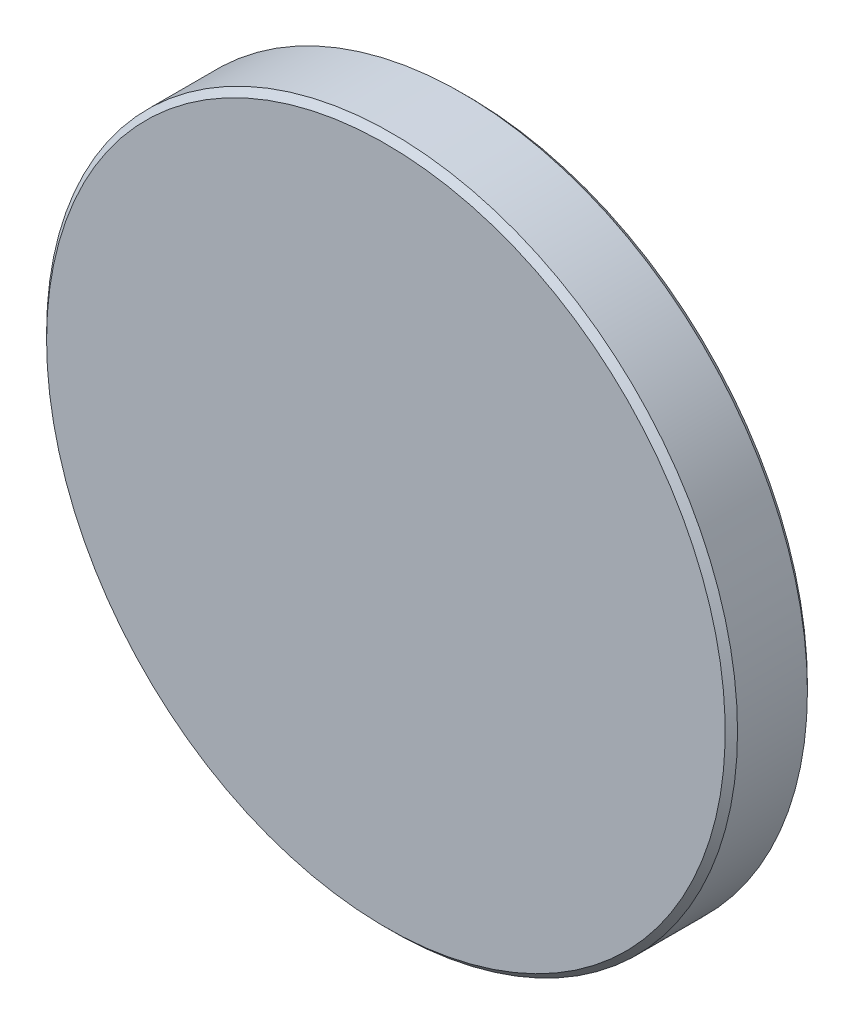
ISO-10303-21;
HEADER;
FILE_DESCRIPTION(('STEP AP214'),'2;1');
FILE_NAME('part.step','',(''),(''),'','','');
FILE_SCHEMA(('AUTOMOTIVE_DESIGN { 1 0 10303 214 1 1 1 1 }'));
ENDSEC;
DATA;
#1=APPLICATION_CONTEXT('core data for automotive mechanical design processes');
#2=APPLICATION_PROTOCOL_DEFINITION('international standard','automotive_design',2000,#1);
#3=PRODUCT_CONTEXT('',#1,'mechanical');
#4=PRODUCT('Part','Part','',(#3));
#5=PRODUCT_RELATED_PRODUCT_CATEGORY('part','',(#4));
#6=PRODUCT_DEFINITION_FORMATION('','',#4);
#7=PRODUCT_DEFINITION_CONTEXT('part definition',#1,'design');
#8=PRODUCT_DEFINITION('design','',#6,#7);
#9=PRODUCT_DEFINITION_SHAPE('','',#8);
#10=(LENGTH_UNIT() NAMED_UNIT(*) SI_UNIT(.MILLI.,.METRE.));
#11=(NAMED_UNIT(*) PLANE_ANGLE_UNIT() SI_UNIT($,.RADIAN.));
#12=(NAMED_UNIT(*) SI_UNIT($,.STERADIAN.) SOLID_ANGLE_UNIT());
#13=UNCERTAINTY_MEASURE_WITH_UNIT(LENGTH_MEASURE(1.E-05),#10,'distance_accuracy_value','');
#14=(GEOMETRIC_REPRESENTATION_CONTEXT(3) GLOBAL_UNCERTAINTY_ASSIGNED_CONTEXT((#13)) GLOBAL_UNIT_ASSIGNED_CONTEXT((#10,
#11,#12)) REPRESENTATION_CONTEXT('',''));
#15=CARTESIAN_POINT('',(0.,0.,0.));
#16=DIRECTION('',(0.,0.,1.));
#17=DIRECTION('',(1.,0.,0.));
#18=AXIS2_PLACEMENT_3D('',#15,#16,#17);
#19=CARTESIAN_POINT('',(0.,0.,4.));
#20=DIRECTION('',(0.,0.,1.));
#21=DIRECTION('',(1.,0.,0.));
#22=AXIS2_PLACEMENT_3D('',#19,#20,#21);
#23=PLANE('',#22);
#24=CARTESIAN_POINT('',(0.,0.,4.));
#25=DIRECTION('',(0.,0.,-1.));
#26=DIRECTION('',(-1.,0.,0.));
#27=AXIS2_PLACEMENT_3D('',#24,#25,#26);
#28=CIRCLE('',#27,16.5072964032);
#29=CARTESIAN_POINT('',(-16.5072964032,0.,4.));
#30=VERTEX_POINT('',#29);
#31=EDGE_CURVE('E18',#30,#30,#28,.T.);
#32=ORIENTED_EDGE('',*,*,#31,.F.);
#33=EDGE_LOOP('',(#32));
#34=FACE_BOUND('',#33,.T.);
#35=ADVANCED_FACE('F15',(#34),#23,.T.);
#36=CARTESIAN_POINT('',(0.,0.,3.7));
#37=DIRECTION('',(0.,0.,-1.));
#38=DIRECTION('',(-1.,0.,0.));
#39=AXIS2_PLACEMENT_3D('',#36,#37,#38);
#40=CONICAL_SURFACE('',#39,16.8072964032,0.785398163397454);
#41=ORIENTED_EDGE('',*,*,#31,.T.);
#42=EDGE_LOOP('',(#41));
#43=FACE_BOUND('',#42,.T.);
#44=CARTESIAN_POINT('',(0.,0.,3.7));
#45=DIRECTION('',(0.,0.,-1.));
#46=DIRECTION('',(-1.,0.,0.));
#47=AXIS2_PLACEMENT_3D('',#44,#45,#46);
#48=CIRCLE('',#47,16.8072964032);
#49=CARTESIAN_POINT('',(-16.8072964032,0.,3.7));
#50=VERTEX_POINT('',#49);
#51=EDGE_CURVE('E26',#50,#50,#48,.T.);
#52=ORIENTED_EDGE('',*,*,#51,.F.);
#53=EDGE_LOOP('',(#52));
#54=FACE_BOUND('',#53,.T.);
#55=ADVANCED_FACE('F35',(#43,#54),#40,.T.);
#56=CARTESIAN_POINT('',(0.,0.,4.));
#57=DIRECTION('',(0.,0.,-1.));
#58=DIRECTION('',(-1.,0.,0.));
#59=AXIS2_PLACEMENT_3D('',#56,#57,#58);
#60=CYLINDRICAL_SURFACE('',#59,16.8072964032);
#61=ORIENTED_EDGE('',*,*,#51,.T.);
#62=EDGE_LOOP('',(#61));
#63=FACE_BOUND('',#62,.T.);
#64=CARTESIAN_POINT('',(0.,0.,0.299999999999995));
#65=DIRECTION('',(0.,0.,1.));
#66=DIRECTION('',(1.,0.,0.));
#67=AXIS2_PLACEMENT_3D('',#64,#65,#66);
#68=CIRCLE('',#67,16.8072964032);
#69=CARTESIAN_POINT('',(16.8072964032,0.,0.299999999999994));
#70=VERTEX_POINT('',#69);
#71=EDGE_CURVE('E22',#70,#70,#68,.F.);
#72=ORIENTED_EDGE('',*,*,#71,.F.);
#73=EDGE_LOOP('',(#72));
#74=FACE_BOUND('',#73,.T.);
#75=ADVANCED_FACE('F43',(#63,#74),#60,.T.);
#76=CARTESIAN_POINT('',(0.,0.,0.299999999999994));
#77=DIRECTION('',(0.,0.,1.));
#78=DIRECTION('',(1.,0.,0.));
#79=AXIS2_PLACEMENT_3D('',#76,#77,#78);
#80=CONICAL_SURFACE('',#79,16.8072964032,0.78539816339745);
#81=CARTESIAN_POINT('',(0.,0.,0.));
#82=DIRECTION('',(0.,0.,1.));
#83=DIRECTION('',(1.,0.,0.));
#84=AXIS2_PLACEMENT_3D('',#81,#82,#83);
#85=CIRCLE('',#84,16.5072964032);
#86=CARTESIAN_POINT('',(16.5072964032,0.,0.));
#87=VERTEX_POINT('',#86);
#88=EDGE_CURVE('E10',#87,#87,#85,.T.);
#89=ORIENTED_EDGE('',*,*,#88,.T.);
#90=EDGE_LOOP('',(#89));
#91=FACE_BOUND('',#90,.T.);
#92=ORIENTED_EDGE('',*,*,#71,.T.);
#93=EDGE_LOOP('',(#92));
#94=FACE_BOUND('',#93,.T.);
#95=ADVANCED_FACE('F46',(#91,#94),#80,.T.);
#96=CARTESIAN_POINT('',(0.,0.,0.));
#97=DIRECTION('',(0.,0.,1.));
#98=DIRECTION('',(1.,0.,0.));
#99=AXIS2_PLACEMENT_3D('',#96,#97,#98);
#100=PLANE('',#99);
#101=ORIENTED_EDGE('',*,*,#88,.F.);
#102=EDGE_LOOP('',(#101));
#103=FACE_BOUND('',#102,.T.);
#104=ADVANCED_FACE('F44',(#103),#100,.F.);
#105=CLOSED_SHELL('',(#35,#55,#75,#95,#104));
#106=MANIFOLD_SOLID_BREP('B1',#105);
#107=ADVANCED_BREP_SHAPE_REPRESENTATION('',(#18,#106),#14);
#108=SHAPE_DEFINITION_REPRESENTATION(#9,#107);
ENDSEC;
END-ISO-10303-21;
